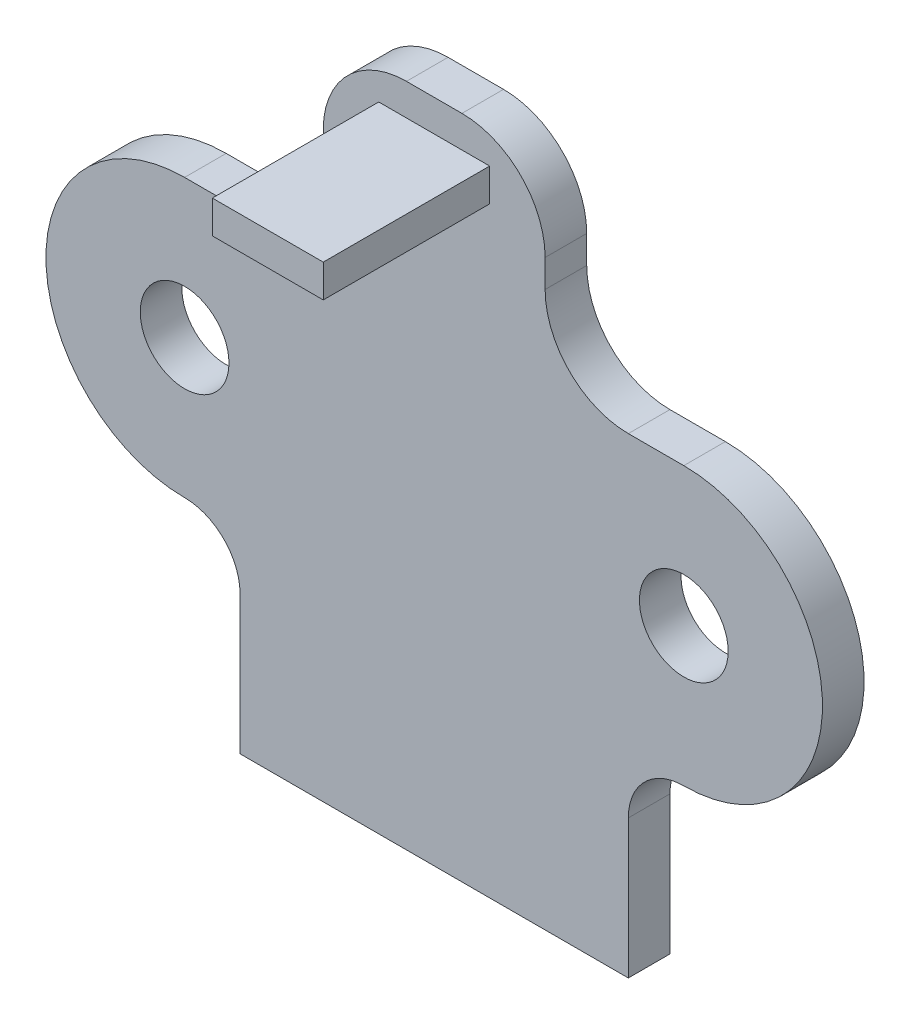
ISO-10303-21;
HEADER;
FILE_DESCRIPTION(('STEP AP214'),'2;1');
FILE_NAME('part.step','',(''),(''),'','','');
FILE_SCHEMA(('AUTOMOTIVE_DESIGN { 1 0 10303 214 1 1 1 1 }'));
ENDSEC;
DATA;
#1=APPLICATION_CONTEXT('core data for automotive mechanical design processes');
#2=APPLICATION_PROTOCOL_DEFINITION('international standard','automotive_design',2000,#1);
#3=PRODUCT_CONTEXT('',#1,'mechanical');
#4=PRODUCT('Part','Part','',(#3));
#5=PRODUCT_RELATED_PRODUCT_CATEGORY('part','',(#4));
#6=PRODUCT_DEFINITION_FORMATION('','',#4);
#7=PRODUCT_DEFINITION_CONTEXT('part definition',#1,'design');
#8=PRODUCT_DEFINITION('design','',#6,#7);
#9=PRODUCT_DEFINITION_SHAPE('','',#8);
#10=(LENGTH_UNIT() NAMED_UNIT(*) SI_UNIT(.MILLI.,.METRE.));
#11=(NAMED_UNIT(*) PLANE_ANGLE_UNIT() SI_UNIT($,.RADIAN.));
#12=(NAMED_UNIT(*) SI_UNIT($,.STERADIAN.) SOLID_ANGLE_UNIT());
#13=UNCERTAINTY_MEASURE_WITH_UNIT(LENGTH_MEASURE(1.E-05),#10,'distance_accuracy_value','');
#14=(GEOMETRIC_REPRESENTATION_CONTEXT(3) GLOBAL_UNCERTAINTY_ASSIGNED_CONTEXT((#13)) GLOBAL_UNIT_ASSIGNED_CONTEXT((#10,
#11,#12)) REPRESENTATION_CONTEXT('',''));
#15=CARTESIAN_POINT('',(0.,0.,0.));
#16=DIRECTION('',(0.,0.,1.));
#17=DIRECTION('',(1.,0.,0.));
#18=AXIS2_PLACEMENT_3D('',#15,#16,#17);
#19=CARTESIAN_POINT('',(-1.,9.,1.5));
#20=DIRECTION('',(0.,0.,1.));
#21=DIRECTION('',(1.,0.,0.));
#22=AXIS2_PLACEMENT_3D('',#19,#20,#21);
#23=PLANE('',#22);
#24=CARTESIAN_POINT('',(-1.,9.,1.5));
#25=DIRECTION('',(0.,0.,1.));
#26=DIRECTION('',(1.,0.,0.));
#27=AXIS2_PLACEMENT_3D('',#24,#25,#26);
#28=CIRCLE('',#27,3.);
#29=CARTESIAN_POINT('',(-1.,12.,1.5));
#30=VERTEX_POINT('',#29);
#31=CARTESIAN_POINT('',(-4.,9.,1.5));
#32=VERTEX_POINT('',#31);
#33=EDGE_CURVE('E191',#30,#32,#28,.T.);
#34=ORIENTED_EDGE('',*,*,#33,.T.);
#35=DIRECTION('',(0.,-1.,0.));
#36=VECTOR('',#35,1.);
#37=CARTESIAN_POINT('',(-4.,9.,1.5));
#38=LINE('',#37,#36);
#39=CARTESIAN_POINT('',(-4.,8.,1.5));
#40=VERTEX_POINT('',#39);
#41=EDGE_CURVE('E194',#32,#40,#38,.T.);
#42=ORIENTED_EDGE('',*,*,#41,.T.);
#43=CARTESIAN_POINT('',(-7.,8.,1.5));
#44=DIRECTION('',(0.,0.,-1.));
#45=DIRECTION('',(-1.,0.,0.));
#46=AXIS2_PLACEMENT_3D('',#43,#44,#45);
#47=CIRCLE('',#46,3.);
#48=CARTESIAN_POINT('',(-7.,5.,1.5));
#49=VERTEX_POINT('',#48);
#50=EDGE_CURVE('E198',#40,#49,#47,.T.);
#51=ORIENTED_EDGE('',*,*,#50,.T.);
#52=DIRECTION('',(-1.,0.,0.));
#53=VECTOR('',#52,1.);
#54=CARTESIAN_POINT('',(-7.,5.,1.5));
#55=LINE('',#54,#53);
#56=CARTESIAN_POINT('',(-9.,5.,1.5));
#57=VERTEX_POINT('',#56);
#58=EDGE_CURVE('E201',#49,#57,#55,.T.);
#59=ORIENTED_EDGE('',*,*,#58,.T.);
#60=CARTESIAN_POINT('',(-9.,0.,1.5));
#61=DIRECTION('',(0.,0.,1.));
#62=DIRECTION('',(1.,0.,0.));
#63=AXIS2_PLACEMENT_3D('',#60,#61,#62);
#64=CIRCLE('',#63,5.);
#65=CARTESIAN_POINT('',(-9.,-5.,1.5));
#66=VERTEX_POINT('',#65);
#67=EDGE_CURVE('E204',#57,#66,#64,.T.);
#68=ORIENTED_EDGE('',*,*,#67,.T.);
#69=CARTESIAN_POINT('',(-9.,-7.,1.5));
#70=DIRECTION('',(0.,0.,-1.));
#71=DIRECTION('',(-1.,0.,0.));
#72=AXIS2_PLACEMENT_3D('',#69,#70,#71);
#73=CIRCLE('',#72,2.);
#74=CARTESIAN_POINT('',(-7.,-7.,1.5));
#75=VERTEX_POINT('',#74);
#76=EDGE_CURVE('E207',#66,#75,#73,.T.);
#77=ORIENTED_EDGE('',*,*,#76,.T.);
#78=DIRECTION('',(0.,-1.,0.));
#79=VECTOR('',#78,1.);
#80=CARTESIAN_POINT('',(-7.,-7.,1.5));
#81=LINE('',#80,#79);
#82=CARTESIAN_POINT('',(-7.,-12.,1.5));
#83=VERTEX_POINT('',#82);
#84=EDGE_CURVE('E210',#75,#83,#81,.T.);
#85=ORIENTED_EDGE('',*,*,#84,.T.);
#86=DIRECTION('',(1.,0.,0.));
#87=VECTOR('',#86,1.);
#88=CARTESIAN_POINT('',(-7.,-12.,1.5));
#89=LINE('',#88,#87);
#90=CARTESIAN_POINT('',(7.,-12.,1.5));
#91=VERTEX_POINT('',#90);
#92=EDGE_CURVE('E213',#83,#91,#89,.T.);
#93=ORIENTED_EDGE('',*,*,#92,.T.);
#94=DIRECTION('',(0.,1.,0.));
#95=VECTOR('',#94,1.);
#96=CARTESIAN_POINT('',(7.,-12.,1.5));
#97=LINE('',#96,#95);
#98=CARTESIAN_POINT('',(7.,-7.,1.5));
#99=VERTEX_POINT('',#98);
#100=EDGE_CURVE('E216',#91,#99,#97,.T.);
#101=ORIENTED_EDGE('',*,*,#100,.T.);
#102=CARTESIAN_POINT('',(9.,-7.,1.5));
#103=DIRECTION('',(0.,0.,-1.));
#104=DIRECTION('',(-1.,0.,0.));
#105=AXIS2_PLACEMENT_3D('',#102,#103,#104);
#106=CIRCLE('',#105,2.);
#107=CARTESIAN_POINT('',(9.,-5.,1.5));
#108=VERTEX_POINT('',#107);
#109=EDGE_CURVE('E219',#99,#108,#106,.T.);
#110=ORIENTED_EDGE('',*,*,#109,.T.);
#111=CARTESIAN_POINT('',(9.,0.,1.5));
#112=DIRECTION('',(0.,0.,1.));
#113=DIRECTION('',(1.,0.,0.));
#114=AXIS2_PLACEMENT_3D('',#111,#112,#113);
#115=CIRCLE('',#114,5.);
#116=CARTESIAN_POINT('',(9.,5.,1.5));
#117=VERTEX_POINT('',#116);
#118=EDGE_CURVE('E222',#108,#117,#115,.T.);
#119=ORIENTED_EDGE('',*,*,#118,.T.);
#120=DIRECTION('',(-1.,0.,0.));
#121=VECTOR('',#120,1.);
#122=CARTESIAN_POINT('',(9.,5.,1.5));
#123=LINE('',#122,#121);
#124=CARTESIAN_POINT('',(7.,5.,1.5));
#125=VERTEX_POINT('',#124);
#126=EDGE_CURVE('E225',#117,#125,#123,.T.);
#127=ORIENTED_EDGE('',*,*,#126,.T.);
#128=CARTESIAN_POINT('',(7.,8.,1.5));
#129=DIRECTION('',(0.,0.,-1.));
#130=DIRECTION('',(-1.,0.,0.));
#131=AXIS2_PLACEMENT_3D('',#128,#129,#130);
#132=CIRCLE('',#131,3.);
#133=CARTESIAN_POINT('',(4.,8.,1.5));
#134=VERTEX_POINT('',#133);
#135=EDGE_CURVE('E228',#125,#134,#132,.T.);
#136=ORIENTED_EDGE('',*,*,#135,.T.);
#137=DIRECTION('',(0.,1.,0.));
#138=VECTOR('',#137,1.);
#139=CARTESIAN_POINT('',(4.,8.,1.5));
#140=LINE('',#139,#138);
#141=CARTESIAN_POINT('',(4.,9.,1.5));
#142=VERTEX_POINT('',#141);
#143=EDGE_CURVE('E231',#134,#142,#140,.T.);
#144=ORIENTED_EDGE('',*,*,#143,.T.);
#145=CARTESIAN_POINT('',(1.,9.,1.5));
#146=DIRECTION('',(0.,0.,1.));
#147=DIRECTION('',(1.,0.,0.));
#148=AXIS2_PLACEMENT_3D('',#145,#146,#147);
#149=CIRCLE('',#148,3.);
#150=CARTESIAN_POINT('',(1.,12.,1.5));
#151=VERTEX_POINT('',#150);
#152=EDGE_CURVE('E168',#142,#151,#149,.T.);
#153=ORIENTED_EDGE('',*,*,#152,.T.);
#154=DIRECTION('',(-1.,0.,0.));
#155=VECTOR('',#154,1.);
#156=CARTESIAN_POINT('',(1.,12.,1.5));
#157=LINE('',#156,#155);
#158=EDGE_CURVE('E234',#151,#30,#157,.T.);
#159=ORIENTED_EDGE('',*,*,#158,.T.);
#160=EDGE_LOOP('',(#34,#42,#51,#59,#68,#77,#85,#93,#101,#110,#119,#127,#136,#144,#153,#159));
#161=FACE_BOUND('',#160,.T.);
#162=CARTESIAN_POINT('',(-9.,0.,1.5));
#163=DIRECTION('',(0.,0.,1.));
#164=DIRECTION('',(1.,0.,0.));
#165=AXIS2_PLACEMENT_3D('',#162,#163,#164);
#166=CIRCLE('',#165,1.59999999999999);
#167=CARTESIAN_POINT('',(-7.40000000000001,0.,1.5));
#168=VERTEX_POINT('',#167);
#169=EDGE_CURVE('E346',#168,#168,#166,.T.);
#170=ORIENTED_EDGE('',*,*,#169,.F.);
#171=EDGE_LOOP('',(#170));
#172=FACE_BOUND('',#171,.T.);
#173=CARTESIAN_POINT('',(9.,0.,1.5));
#174=DIRECTION('',(0.,0.,1.));
#175=DIRECTION('',(1.,0.,0.));
#176=AXIS2_PLACEMENT_3D('',#173,#174,#175);
#177=CIRCLE('',#176,1.59999999999999);
#178=CARTESIAN_POINT('',(10.6,0.,1.5));
#179=VERTEX_POINT('',#178);
#180=EDGE_CURVE('E334',#179,#179,#177,.T.);
#181=ORIENTED_EDGE('',*,*,#180,.F.);
#182=EDGE_LOOP('',(#181));
#183=FACE_BOUND('',#182,.T.);
#184=DIRECTION('',(-1.,0.,0.));
#185=VECTOR('',#184,1.);
#186=CARTESIAN_POINT('',(-2.,10.8553862571716,1.5));
#187=LINE('',#186,#185);
#188=CARTESIAN_POINT('',(2.,10.8553862571716,1.5));
#189=VERTEX_POINT('',#188);
#190=CARTESIAN_POINT('',(-2.,10.8553862571716,1.5));
#191=VERTEX_POINT('',#190);
#192=EDGE_CURVE('E600',#189,#191,#187,.T.);
#193=ORIENTED_EDGE('',*,*,#192,.F.);
#194=DIRECTION('',(0.,1.,0.));
#195=VECTOR('',#194,1.);
#196=CARTESIAN_POINT('',(2.,10.8553862571716,1.5));
#197=LINE('',#196,#195);
#198=CARTESIAN_POINT('',(2.,9.6738475561142,1.5));
#199=VERTEX_POINT('',#198);
#200=EDGE_CURVE('E331',#199,#189,#197,.T.);
#201=ORIENTED_EDGE('',*,*,#200,.F.);
#202=DIRECTION('',(1.,0.,0.));
#203=VECTOR('',#202,1.);
#204=CARTESIAN_POINT('',(2.,9.6738475561142,1.5));
#205=LINE('',#204,#203);
#206=CARTESIAN_POINT('',(-2.,9.6738475561142,1.5));
#207=VERTEX_POINT('',#206);
#208=EDGE_CURVE('E324',#207,#199,#205,.T.);
#209=ORIENTED_EDGE('',*,*,#208,.F.);
#210=DIRECTION('',(0.,-1.,0.));
#211=VECTOR('',#210,1.);
#212=CARTESIAN_POINT('',(-2.,9.6738475561142,1.5));
#213=LINE('',#212,#211);
#214=EDGE_CURVE('E603',#191,#207,#213,.T.);
#215=ORIENTED_EDGE('',*,*,#214,.F.);
#216=EDGE_LOOP('',(#193,#201,#209,#215));
#217=FACE_BOUND('',#216,.T.);
#218=ADVANCED_FACE('F32',(#161,#172,#183,#217),#23,.T.);
#219=CARTESIAN_POINT('',(-1.,9.,0.));
#220=DIRECTION('',(0.,0.,1.));
#221=DIRECTION('',(1.,0.,0.));
#222=AXIS2_PLACEMENT_3D('',#219,#220,#221);
#223=CYLINDRICAL_SURFACE('',#222,3.);
#224=ORIENTED_EDGE('',*,*,#33,.F.);
#225=DIRECTION('',(0.,0.,1.));
#226=VECTOR('',#225,1.);
#227=CARTESIAN_POINT('',(-1.,12.,0.));
#228=LINE('',#227,#226);
#229=CARTESIAN_POINT('',(-1.,12.,0.));
#230=VERTEX_POINT('',#229);
#231=EDGE_CURVE('E11',#230,#30,#228,.T.);
#232=ORIENTED_EDGE('',*,*,#231,.F.);
#233=CARTESIAN_POINT('',(-1.,9.,0.));
#234=DIRECTION('',(0.,0.,1.));
#235=DIRECTION('',(1.,0.,0.));
#236=AXIS2_PLACEMENT_3D('',#233,#234,#235);
#237=CIRCLE('',#236,3.);
#238=CARTESIAN_POINT('',(-4.,9.,0.));
#239=VERTEX_POINT('',#238);
#240=EDGE_CURVE('E236',#230,#239,#237,.T.);
#241=ORIENTED_EDGE('',*,*,#240,.T.);
#242=DIRECTION('',(0.,0.,1.));
#243=VECTOR('',#242,1.);
#244=CARTESIAN_POINT('',(-4.,9.,0.));
#245=LINE('',#244,#243);
#246=EDGE_CURVE('E36',#239,#32,#245,.T.);
#247=ORIENTED_EDGE('',*,*,#246,.T.);
#248=EDGE_LOOP('',(#224,#232,#241,#247));
#249=FACE_BOUND('',#248,.T.);
#250=ADVANCED_FACE('F34',(#249),#223,.T.);
#251=CARTESIAN_POINT('',(1.,12.,0.));
#252=DIRECTION('',(0.,1.,0.));
#253=DIRECTION('',(0.,0.,1.));
#254=AXIS2_PLACEMENT_3D('',#251,#252,#253);
#255=PLANE('',#254);
#256=ORIENTED_EDGE('',*,*,#158,.F.);
#257=DIRECTION('',(0.,0.,1.));
#258=VECTOR('',#257,1.);
#259=CARTESIAN_POINT('',(1.,12.,0.));
#260=LINE('',#259,#258);
#261=CARTESIAN_POINT('',(1.,12.,0.));
#262=VERTEX_POINT('',#261);
#263=EDGE_CURVE('E41',#262,#151,#260,.T.);
#264=ORIENTED_EDGE('',*,*,#263,.F.);
#265=DIRECTION('',(-1.,0.,0.));
#266=VECTOR('',#265,1.);
#267=CARTESIAN_POINT('',(1.,12.,0.));
#268=LINE('',#267,#266);
#269=EDGE_CURVE('E181',#262,#230,#268,.T.);
#270=ORIENTED_EDGE('',*,*,#269,.T.);
#271=ORIENTED_EDGE('',*,*,#231,.T.);
#272=EDGE_LOOP('',(#256,#264,#270,#271));
#273=FACE_BOUND('',#272,.T.);
#274=ADVANCED_FACE('F264',(#273),#255,.T.);
#275=CARTESIAN_POINT('',(1.,9.,0.));
#276=DIRECTION('',(0.,0.,1.));
#277=DIRECTION('',(1.,0.,0.));
#278=AXIS2_PLACEMENT_3D('',#275,#276,#277);
#279=CYLINDRICAL_SURFACE('',#278,3.);
#280=ORIENTED_EDGE('',*,*,#152,.F.);
#281=DIRECTION('',(0.,0.,1.));
#282=VECTOR('',#281,1.);
#283=CARTESIAN_POINT('',(4.,9.,0.));
#284=LINE('',#283,#282);
#285=CARTESIAN_POINT('',(4.,9.,0.));
#286=VERTEX_POINT('',#285);
#287=EDGE_CURVE('E162',#286,#142,#284,.T.);
#288=ORIENTED_EDGE('',*,*,#287,.F.);
#289=CARTESIAN_POINT('',(1.,9.,0.));
#290=DIRECTION('',(0.,0.,1.));
#291=DIRECTION('',(1.,0.,0.));
#292=AXIS2_PLACEMENT_3D('',#289,#290,#291);
#293=CIRCLE('',#292,3.);
#294=EDGE_CURVE('E165',#286,#262,#293,.T.);
#295=ORIENTED_EDGE('',*,*,#294,.T.);
#296=ORIENTED_EDGE('',*,*,#263,.T.);
#297=EDGE_LOOP('',(#280,#288,#295,#296));
#298=FACE_BOUND('',#297,.T.);
#299=ADVANCED_FACE('F164',(#298),#279,.T.);
#300=CARTESIAN_POINT('',(4.,8.,0.));
#301=DIRECTION('',(1.,0.,0.));
#302=DIRECTION('',(0.,0.,-1.));
#303=AXIS2_PLACEMENT_3D('',#300,#301,#302);
#304=PLANE('',#303);
#305=ORIENTED_EDGE('',*,*,#143,.F.);
#306=DIRECTION('',(0.,0.,1.));
#307=VECTOR('',#306,1.);
#308=CARTESIAN_POINT('',(4.,8.,0.));
#309=LINE('',#308,#307);
#310=CARTESIAN_POINT('',(4.,8.,0.));
#311=VERTEX_POINT('',#310);
#312=EDGE_CURVE('E173',#311,#134,#309,.T.);
#313=ORIENTED_EDGE('',*,*,#312,.F.);
#314=DIRECTION('',(0.,1.,0.));
#315=VECTOR('',#314,1.);
#316=CARTESIAN_POINT('',(4.,8.,0.));
#317=LINE('',#316,#315);
#318=EDGE_CURVE('E179',#311,#286,#317,.T.);
#319=ORIENTED_EDGE('',*,*,#318,.T.);
#320=ORIENTED_EDGE('',*,*,#287,.T.);
#321=EDGE_LOOP('',(#305,#313,#319,#320));
#322=FACE_BOUND('',#321,.T.);
#323=ADVANCED_FACE('F183',(#322),#304,.T.);
#324=CARTESIAN_POINT('',(7.,8.,0.));
#325=DIRECTION('',(0.,0.,1.));
#326=DIRECTION('',(1.,0.,0.));
#327=AXIS2_PLACEMENT_3D('',#324,#325,#326);
#328=CYLINDRICAL_SURFACE('',#327,3.);
#329=ORIENTED_EDGE('',*,*,#135,.F.);
#330=DIRECTION('',(0.,0.,1.));
#331=VECTOR('',#330,1.);
#332=CARTESIAN_POINT('',(7.,5.,0.));
#333=LINE('',#332,#331);
#334=CARTESIAN_POINT('',(7.,5.,0.));
#335=VERTEX_POINT('',#334);
#336=EDGE_CURVE('E240',#335,#125,#333,.T.);
#337=ORIENTED_EDGE('',*,*,#336,.F.);
#338=CARTESIAN_POINT('',(7.,8.,0.));
#339=DIRECTION('',(0.,0.,-1.));
#340=DIRECTION('',(-1.,0.,0.));
#341=AXIS2_PLACEMENT_3D('',#338,#339,#340);
#342=CIRCLE('',#341,3.);
#343=EDGE_CURVE('E184',#335,#311,#342,.T.);
#344=ORIENTED_EDGE('',*,*,#343,.T.);
#345=ORIENTED_EDGE('',*,*,#312,.T.);
#346=EDGE_LOOP('',(#329,#337,#344,#345));
#347=FACE_BOUND('',#346,.T.);
#348=ADVANCED_FACE('F422',(#347),#328,.F.);
#349=CARTESIAN_POINT('',(9.,5.,0.));
#350=DIRECTION('',(0.,1.,0.));
#351=DIRECTION('',(0.,0.,1.));
#352=AXIS2_PLACEMENT_3D('',#349,#350,#351);
#353=PLANE('',#352);
#354=ORIENTED_EDGE('',*,*,#126,.F.);
#355=DIRECTION('',(0.,0.,1.));
#356=VECTOR('',#355,1.);
#357=CARTESIAN_POINT('',(9.,5.,0.));
#358=LINE('',#357,#356);
#359=CARTESIAN_POINT('',(9.,5.,0.));
#360=VERTEX_POINT('',#359);
#361=EDGE_CURVE('E242',#360,#117,#358,.T.);
#362=ORIENTED_EDGE('',*,*,#361,.F.);
#363=DIRECTION('',(-1.,0.,0.));
#364=VECTOR('',#363,1.);
#365=CARTESIAN_POINT('',(9.,5.,0.));
#366=LINE('',#365,#364);
#367=EDGE_CURVE('E186',#360,#335,#366,.T.);
#368=ORIENTED_EDGE('',*,*,#367,.T.);
#369=ORIENTED_EDGE('',*,*,#336,.T.);
#370=EDGE_LOOP('',(#354,#362,#368,#369));
#371=FACE_BOUND('',#370,.T.);
#372=ADVANCED_FACE('F384',(#371),#353,.T.);
#373=CARTESIAN_POINT('',(9.,0.,0.));
#374=DIRECTION('',(0.,0.,1.));
#375=DIRECTION('',(1.,0.,0.));
#376=AXIS2_PLACEMENT_3D('',#373,#374,#375);
#377=CYLINDRICAL_SURFACE('',#376,5.);
#378=ORIENTED_EDGE('',*,*,#118,.F.);
#379=DIRECTION('',(0.,0.,1.));
#380=VECTOR('',#379,1.);
#381=CARTESIAN_POINT('',(9.,-5.,0.));
#382=LINE('',#381,#380);
#383=CARTESIAN_POINT('',(9.,-5.,0.));
#384=VERTEX_POINT('',#383);
#385=EDGE_CURVE('E244',#384,#108,#382,.T.);
#386=ORIENTED_EDGE('',*,*,#385,.F.);
#387=CARTESIAN_POINT('',(9.,0.,0.));
#388=DIRECTION('',(0.,0.,1.));
#389=DIRECTION('',(1.,0.,0.));
#390=AXIS2_PLACEMENT_3D('',#387,#388,#389);
#391=CIRCLE('',#390,5.);
#392=EDGE_CURVE('E378',#384,#360,#391,.T.);
#393=ORIENTED_EDGE('',*,*,#392,.T.);
#394=ORIENTED_EDGE('',*,*,#361,.T.);
#395=EDGE_LOOP('',(#378,#386,#393,#394));
#396=FACE_BOUND('',#395,.T.);
#397=ADVANCED_FACE('F390',(#396),#377,.T.);
#398=CARTESIAN_POINT('',(9.,-7.,0.));
#399=DIRECTION('',(0.,0.,1.));
#400=DIRECTION('',(1.,0.,0.));
#401=AXIS2_PLACEMENT_3D('',#398,#399,#400);
#402=CYLINDRICAL_SURFACE('',#401,2.);
#403=ORIENTED_EDGE('',*,*,#109,.F.);
#404=DIRECTION('',(0.,0.,1.));
#405=VECTOR('',#404,1.);
#406=CARTESIAN_POINT('',(7.,-7.,0.));
#407=LINE('',#406,#405);
#408=CARTESIAN_POINT('',(7.,-7.,0.));
#409=VERTEX_POINT('',#408);
#410=EDGE_CURVE('E246',#409,#99,#407,.T.);
#411=ORIENTED_EDGE('',*,*,#410,.F.);
#412=CARTESIAN_POINT('',(9.,-7.,0.));
#413=DIRECTION('',(0.,0.,-1.));
#414=DIRECTION('',(-1.,0.,0.));
#415=AXIS2_PLACEMENT_3D('',#412,#413,#414);
#416=CIRCLE('',#415,2.);
#417=EDGE_CURVE('E375',#409,#384,#416,.T.);
#418=ORIENTED_EDGE('',*,*,#417,.T.);
#419=ORIENTED_EDGE('',*,*,#385,.T.);
#420=EDGE_LOOP('',(#403,#411,#418,#419));
#421=FACE_BOUND('',#420,.T.);
#422=ADVANCED_FACE('F393',(#421),#402,.F.);
#423=CARTESIAN_POINT('',(7.,-12.,0.));
#424=DIRECTION('',(1.,0.,0.));
#425=DIRECTION('',(0.,1.,0.));
#426=AXIS2_PLACEMENT_3D('',#423,#424,#425);
#427=PLANE('',#426);
#428=ORIENTED_EDGE('',*,*,#100,.F.);
#429=DIRECTION('',(0.,0.,1.));
#430=VECTOR('',#429,1.);
#431=CARTESIAN_POINT('',(7.,-12.,0.));
#432=LINE('',#431,#430);
#433=CARTESIAN_POINT('',(7.,-12.,0.));
#434=VERTEX_POINT('',#433);
#435=EDGE_CURVE('E248',#434,#91,#432,.T.);
#436=ORIENTED_EDGE('',*,*,#435,.F.);
#437=DIRECTION('',(0.,1.,0.));
#438=VECTOR('',#437,1.);
#439=CARTESIAN_POINT('',(7.,-12.,0.));
#440=LINE('',#439,#438);
#441=EDGE_CURVE('E372',#434,#409,#440,.T.);
#442=ORIENTED_EDGE('',*,*,#441,.T.);
#443=ORIENTED_EDGE('',*,*,#410,.T.);
#444=EDGE_LOOP('',(#428,#436,#442,#443));
#445=FACE_BOUND('',#444,.T.);
#446=ADVANCED_FACE('F398',(#445),#427,.T.);
#447=CARTESIAN_POINT('',(-7.,-12.,0.));
#448=DIRECTION('',(0.,-1.,0.));
#449=DIRECTION('',(1.,0.,0.));
#450=AXIS2_PLACEMENT_3D('',#447,#448,#449);
#451=PLANE('',#450);
#452=ORIENTED_EDGE('',*,*,#92,.F.);
#453=DIRECTION('',(0.,0.,1.));
#454=VECTOR('',#453,1.);
#455=CARTESIAN_POINT('',(-7.,-12.,0.));
#456=LINE('',#455,#454);
#457=CARTESIAN_POINT('',(-7.,-12.,0.));
#458=VERTEX_POINT('',#457);
#459=EDGE_CURVE('E250',#458,#83,#456,.T.);
#460=ORIENTED_EDGE('',*,*,#459,.F.);
#461=DIRECTION('',(1.,0.,0.));
#462=VECTOR('',#461,1.);
#463=CARTESIAN_POINT('',(-7.,-12.,0.));
#464=LINE('',#463,#462);
#465=EDGE_CURVE('E369',#458,#434,#464,.T.);
#466=ORIENTED_EDGE('',*,*,#465,.T.);
#467=ORIENTED_EDGE('',*,*,#435,.T.);
#468=EDGE_LOOP('',(#452,#460,#466,#467));
#469=FACE_BOUND('',#468,.T.);
#470=ADVANCED_FACE('F401',(#469),#451,.T.);
#471=CARTESIAN_POINT('',(-7.,-7.,0.));
#472=DIRECTION('',(-1.,0.,0.));
#473=DIRECTION('',(0.,-1.,0.));
#474=AXIS2_PLACEMENT_3D('',#471,#472,#473);
#475=PLANE('',#474);
#476=ORIENTED_EDGE('',*,*,#84,.F.);
#477=DIRECTION('',(0.,0.,1.));
#478=VECTOR('',#477,1.);
#479=CARTESIAN_POINT('',(-7.,-7.,0.));
#480=LINE('',#479,#478);
#481=CARTESIAN_POINT('',(-7.,-7.,0.));
#482=VERTEX_POINT('',#481);
#483=EDGE_CURVE('E252',#482,#75,#480,.T.);
#484=ORIENTED_EDGE('',*,*,#483,.F.);
#485=DIRECTION('',(0.,-1.,0.));
#486=VECTOR('',#485,1.);
#487=CARTESIAN_POINT('',(-7.,-7.,0.));
#488=LINE('',#487,#486);
#489=EDGE_CURVE('E366',#482,#458,#488,.T.);
#490=ORIENTED_EDGE('',*,*,#489,.T.);
#491=ORIENTED_EDGE('',*,*,#459,.T.);
#492=EDGE_LOOP('',(#476,#484,#490,#491));
#493=FACE_BOUND('',#492,.T.);
#494=ADVANCED_FACE('F406',(#493),#475,.T.);
#495=CARTESIAN_POINT('',(-9.,-7.,0.));
#496=DIRECTION('',(0.,0.,1.));
#497=DIRECTION('',(1.,0.,0.));
#498=AXIS2_PLACEMENT_3D('',#495,#496,#497);
#499=CYLINDRICAL_SURFACE('',#498,2.);
#500=ORIENTED_EDGE('',*,*,#76,.F.);
#501=DIRECTION('',(0.,0.,1.));
#502=VECTOR('',#501,1.);
#503=CARTESIAN_POINT('',(-9.,-5.,0.));
#504=LINE('',#503,#502);
#505=CARTESIAN_POINT('',(-9.,-5.,0.));
#506=VERTEX_POINT('',#505);
#507=EDGE_CURVE('E254',#506,#66,#504,.T.);
#508=ORIENTED_EDGE('',*,*,#507,.F.);
#509=CARTESIAN_POINT('',(-9.,-7.,0.));
#510=DIRECTION('',(0.,0.,-1.));
#511=DIRECTION('',(-1.,0.,0.));
#512=AXIS2_PLACEMENT_3D('',#509,#510,#511);
#513=CIRCLE('',#512,2.);
#514=EDGE_CURVE('E363',#506,#482,#513,.T.);
#515=ORIENTED_EDGE('',*,*,#514,.T.);
#516=ORIENTED_EDGE('',*,*,#483,.T.);
#517=EDGE_LOOP('',(#500,#508,#515,#516));
#518=FACE_BOUND('',#517,.T.);
#519=ADVANCED_FACE('F409',(#518),#499,.F.);
#520=CARTESIAN_POINT('',(-9.,0.,0.));
#521=DIRECTION('',(0.,0.,1.));
#522=DIRECTION('',(1.,0.,0.));
#523=AXIS2_PLACEMENT_3D('',#520,#521,#522);
#524=CYLINDRICAL_SURFACE('',#523,5.);
#525=ORIENTED_EDGE('',*,*,#67,.F.);
#526=DIRECTION('',(0.,0.,1.));
#527=VECTOR('',#526,1.);
#528=CARTESIAN_POINT('',(-9.,5.,0.));
#529=LINE('',#528,#527);
#530=CARTESIAN_POINT('',(-9.,5.,0.));
#531=VERTEX_POINT('',#530);
#532=EDGE_CURVE('E256',#531,#57,#529,.T.);
#533=ORIENTED_EDGE('',*,*,#532,.F.);
#534=CARTESIAN_POINT('',(-9.,0.,0.));
#535=DIRECTION('',(0.,0.,1.));
#536=DIRECTION('',(1.,0.,0.));
#537=AXIS2_PLACEMENT_3D('',#534,#535,#536);
#538=CIRCLE('',#537,5.);
#539=EDGE_CURVE('E360',#531,#506,#538,.T.);
#540=ORIENTED_EDGE('',*,*,#539,.T.);
#541=ORIENTED_EDGE('',*,*,#507,.T.);
#542=EDGE_LOOP('',(#525,#533,#540,#541));
#543=FACE_BOUND('',#542,.T.);
#544=ADVANCED_FACE('F414',(#543),#524,.T.);
#545=CARTESIAN_POINT('',(-7.,5.,0.));
#546=DIRECTION('',(0.,1.,0.));
#547=DIRECTION('',(-1.,0.,0.));
#548=AXIS2_PLACEMENT_3D('',#545,#546,#547);
#549=PLANE('',#548);
#550=ORIENTED_EDGE('',*,*,#58,.F.);
#551=DIRECTION('',(0.,0.,1.));
#552=VECTOR('',#551,1.);
#553=CARTESIAN_POINT('',(-7.,5.,0.));
#554=LINE('',#553,#552);
#555=CARTESIAN_POINT('',(-7.,5.,0.));
#556=VERTEX_POINT('',#555);
#557=EDGE_CURVE('E258',#556,#49,#554,.T.);
#558=ORIENTED_EDGE('',*,*,#557,.F.);
#559=DIRECTION('',(-1.,0.,0.));
#560=VECTOR('',#559,1.);
#561=CARTESIAN_POINT('',(-7.,5.,0.));
#562=LINE('',#561,#560);
#563=EDGE_CURVE('E357',#556,#531,#562,.T.);
#564=ORIENTED_EDGE('',*,*,#563,.T.);
#565=ORIENTED_EDGE('',*,*,#532,.T.);
#566=EDGE_LOOP('',(#550,#558,#564,#565));
#567=FACE_BOUND('',#566,.T.);
#568=ADVANCED_FACE('F417',(#567),#549,.T.);
#569=CARTESIAN_POINT('',(-7.,8.,0.));
#570=DIRECTION('',(0.,0.,1.));
#571=DIRECTION('',(1.,0.,0.));
#572=AXIS2_PLACEMENT_3D('',#569,#570,#571);
#573=CYLINDRICAL_SURFACE('',#572,3.);
#574=ORIENTED_EDGE('',*,*,#50,.F.);
#575=DIRECTION('',(0.,0.,1.));
#576=VECTOR('',#575,1.);
#577=CARTESIAN_POINT('',(-4.,8.,0.));
#578=LINE('',#577,#576);
#579=CARTESIAN_POINT('',(-4.,8.,0.));
#580=VERTEX_POINT('',#579);
#581=EDGE_CURVE('E259',#580,#40,#578,.T.);
#582=ORIENTED_EDGE('',*,*,#581,.F.);
#583=CARTESIAN_POINT('',(-7.,8.,0.));
#584=DIRECTION('',(0.,0.,-1.));
#585=DIRECTION('',(-1.,0.,0.));
#586=AXIS2_PLACEMENT_3D('',#583,#584,#585);
#587=CIRCLE('',#586,3.);
#588=EDGE_CURVE('E354',#580,#556,#587,.T.);
#589=ORIENTED_EDGE('',*,*,#588,.T.);
#590=ORIENTED_EDGE('',*,*,#557,.T.);
#591=EDGE_LOOP('',(#574,#582,#589,#590));
#592=FACE_BOUND('',#591,.T.);
#593=ADVANCED_FACE('F420',(#592),#573,.F.);
#594=CARTESIAN_POINT('',(-4.,9.,0.));
#595=DIRECTION('',(-1.,0.,0.));
#596=DIRECTION('',(0.,0.,1.));
#597=AXIS2_PLACEMENT_3D('',#594,#595,#596);
#598=PLANE('',#597);
#599=ORIENTED_EDGE('',*,*,#41,.F.);
#600=ORIENTED_EDGE('',*,*,#246,.F.);
#601=DIRECTION('',(0.,-1.,0.));
#602=VECTOR('',#601,1.);
#603=CARTESIAN_POINT('',(-4.,9.,0.));
#604=LINE('',#603,#602);
#605=EDGE_CURVE('E352',#239,#580,#604,.T.);
#606=ORIENTED_EDGE('',*,*,#605,.T.);
#607=ORIENTED_EDGE('',*,*,#581,.T.);
#608=EDGE_LOOP('',(#599,#600,#606,#607));
#609=FACE_BOUND('',#608,.T.);
#610=ADVANCED_FACE('F261',(#609),#598,.T.);
#611=CARTESIAN_POINT('',(-1.,9.,0.));
#612=DIRECTION('',(0.,0.,1.));
#613=DIRECTION('',(1.,0.,0.));
#614=AXIS2_PLACEMENT_3D('',#611,#612,#613);
#615=PLANE('',#614);
#616=CARTESIAN_POINT('',(9.,0.,0.));
#617=DIRECTION('',(0.,0.,1.));
#618=DIRECTION('',(1.,0.,0.));
#619=AXIS2_PLACEMENT_3D('',#616,#617,#618);
#620=CIRCLE('',#619,1.59999999999999);
#621=CARTESIAN_POINT('',(10.6,0.,0.));
#622=VERTEX_POINT('',#621);
#623=EDGE_CURVE('E338',#622,#622,#620,.T.);
#624=ORIENTED_EDGE('',*,*,#623,.T.);
#625=EDGE_LOOP('',(#624));
#626=FACE_BOUND('',#625,.T.);
#627=CARTESIAN_POINT('',(-9.,0.,0.));
#628=DIRECTION('',(0.,0.,1.));
#629=DIRECTION('',(1.,0.,0.));
#630=AXIS2_PLACEMENT_3D('',#627,#628,#629);
#631=CIRCLE('',#630,1.59999999999999);
#632=CARTESIAN_POINT('',(-7.40000000000001,0.,0.));
#633=VERTEX_POINT('',#632);
#634=EDGE_CURVE('E195',#633,#633,#631,.T.);
#635=ORIENTED_EDGE('',*,*,#634,.T.);
#636=EDGE_LOOP('',(#635));
#637=FACE_BOUND('',#636,.T.);
#638=ORIENTED_EDGE('',*,*,#240,.F.);
#639=ORIENTED_EDGE('',*,*,#269,.F.);
#640=ORIENTED_EDGE('',*,*,#294,.F.);
#641=ORIENTED_EDGE('',*,*,#318,.F.);
#642=ORIENTED_EDGE('',*,*,#343,.F.);
#643=ORIENTED_EDGE('',*,*,#367,.F.);
#644=ORIENTED_EDGE('',*,*,#392,.F.);
#645=ORIENTED_EDGE('',*,*,#417,.F.);
#646=ORIENTED_EDGE('',*,*,#441,.F.);
#647=ORIENTED_EDGE('',*,*,#465,.F.);
#648=ORIENTED_EDGE('',*,*,#489,.F.);
#649=ORIENTED_EDGE('',*,*,#514,.F.);
#650=ORIENTED_EDGE('',*,*,#539,.F.);
#651=ORIENTED_EDGE('',*,*,#563,.F.);
#652=ORIENTED_EDGE('',*,*,#588,.F.);
#653=ORIENTED_EDGE('',*,*,#605,.F.);
#654=EDGE_LOOP('',(#638,#639,#640,#641,#642,#643,#644,#645,#646,#647,#648,#649,#650,#651,#652,#653));
#655=FACE_BOUND('',#654,.T.);
#656=ADVANCED_FACE('F177',(#626,#637,#655),#615,.F.);
#657=CARTESIAN_POINT('',(-9.,0.,1.5));
#658=DIRECTION('',(0.,0.,1.));
#659=DIRECTION('',(1.,0.,0.));
#660=AXIS2_PLACEMENT_3D('',#657,#658,#659);
#661=CYLINDRICAL_SURFACE('',#660,1.59999999999999);
#662=ORIENTED_EDGE('',*,*,#634,.F.);
#663=EDGE_LOOP('',(#662));
#664=FACE_BOUND('',#663,.T.);
#665=ORIENTED_EDGE('',*,*,#169,.T.);
#666=EDGE_LOOP('',(#665));
#667=FACE_BOUND('',#666,.T.);
#668=ADVANCED_FACE('F279',(#664,#667),#661,.F.);
#669=CARTESIAN_POINT('',(9.,0.,1.5));
#670=DIRECTION('',(0.,0.,1.));
#671=DIRECTION('',(1.,0.,0.));
#672=AXIS2_PLACEMENT_3D('',#669,#670,#671);
#673=CYLINDRICAL_SURFACE('',#672,1.59999999999999);
#674=ORIENTED_EDGE('',*,*,#623,.F.);
#675=EDGE_LOOP('',(#674));
#676=FACE_BOUND('',#675,.T.);
#677=ORIENTED_EDGE('',*,*,#180,.T.);
#678=EDGE_LOOP('',(#677));
#679=FACE_BOUND('',#678,.T.);
#680=ADVANCED_FACE('F283',(#676,#679),#673,.F.);
#681=CARTESIAN_POINT('',(2.,10.8553862571716,7.5));
#682=DIRECTION('',(-1.,0.,0.));
#683=DIRECTION('',(0.,0.,1.));
#684=AXIS2_PLACEMENT_3D('',#681,#682,#683);
#685=PLANE('',#684);
#686=ORIENTED_EDGE('',*,*,#200,.T.);
#687=DIRECTION('',(0.,0.,-1.));
#688=VECTOR('',#687,1.);
#689=CARTESIAN_POINT('',(2.,10.8553862571716,7.5));
#690=LINE('',#689,#688);
#691=CARTESIAN_POINT('',(2.,10.8553862571716,7.5));
#692=VERTEX_POINT('',#691);
#693=EDGE_CURVE('E328',#692,#189,#690,.T.);
#694=ORIENTED_EDGE('',*,*,#693,.F.);
#695=DIRECTION('',(0.,1.,0.));
#696=VECTOR('',#695,1.);
#697=CARTESIAN_POINT('',(2.,10.8553862571716,7.5));
#698=LINE('',#697,#696);
#699=CARTESIAN_POINT('',(2.,9.6738475561142,7.5));
#700=VERTEX_POINT('',#699);
#701=EDGE_CURVE('E313',#700,#692,#698,.T.);
#702=ORIENTED_EDGE('',*,*,#701,.F.);
#703=DIRECTION('',(0.,0.,-1.));
#704=VECTOR('',#703,1.);
#705=CARTESIAN_POINT('',(2.,9.6738475561142,7.5));
#706=LINE('',#705,#704);
#707=EDGE_CURVE('E611',#700,#199,#706,.T.);
#708=ORIENTED_EDGE('',*,*,#707,.T.);
#709=EDGE_LOOP('',(#686,#694,#702,#708));
#710=FACE_BOUND('',#709,.T.);
#711=ADVANCED_FACE('F287',(#710),#685,.F.);
#712=CARTESIAN_POINT('',(-2.,10.8553862571716,7.5));
#713=DIRECTION('',(0.,-1.,0.));
#714=DIRECTION('',(0.,0.,-1.));
#715=AXIS2_PLACEMENT_3D('',#712,#713,#714);
#716=PLANE('',#715);
#717=ORIENTED_EDGE('',*,*,#192,.T.);
#718=DIRECTION('',(0.,0.,-1.));
#719=VECTOR('',#718,1.);
#720=CARTESIAN_POINT('',(-2.,10.8553862571716,7.5));
#721=LINE('',#720,#719);
#722=CARTESIAN_POINT('',(-2.,10.8553862571716,7.5));
#723=VERTEX_POINT('',#722);
#724=EDGE_CURVE('E335',#723,#191,#721,.T.);
#725=ORIENTED_EDGE('',*,*,#724,.F.);
#726=DIRECTION('',(-1.,0.,0.));
#727=VECTOR('',#726,1.);
#728=CARTESIAN_POINT('',(-2.,10.8553862571716,7.5));
#729=LINE('',#728,#727);
#730=EDGE_CURVE('E318',#692,#723,#729,.T.);
#731=ORIENTED_EDGE('',*,*,#730,.F.);
#732=ORIENTED_EDGE('',*,*,#693,.T.);
#733=EDGE_LOOP('',(#717,#725,#731,#732));
#734=FACE_BOUND('',#733,.T.);
#735=ADVANCED_FACE('F291',(#734),#716,.F.);
#736=CARTESIAN_POINT('',(-2.,9.6738475561142,7.5));
#737=DIRECTION('',(1.,0.,0.));
#738=DIRECTION('',(0.,0.,-1.));
#739=AXIS2_PLACEMENT_3D('',#736,#737,#738);
#740=PLANE('',#739);
#741=ORIENTED_EDGE('',*,*,#214,.T.);
#742=DIRECTION('',(0.,0.,-1.));
#743=VECTOR('',#742,1.);
#744=CARTESIAN_POINT('',(-2.,9.6738475561142,7.5));
#745=LINE('',#744,#743);
#746=CARTESIAN_POINT('',(-2.,9.6738475561142,7.5));
#747=VERTEX_POINT('',#746);
#748=EDGE_CURVE('E49',#747,#207,#745,.T.);
#749=ORIENTED_EDGE('',*,*,#748,.F.);
#750=DIRECTION('',(0.,-1.,0.));
#751=VECTOR('',#750,1.);
#752=CARTESIAN_POINT('',(-2.,9.6738475561142,7.5));
#753=LINE('',#752,#751);
#754=EDGE_CURVE('E612',#723,#747,#753,.T.);
#755=ORIENTED_EDGE('',*,*,#754,.F.);
#756=ORIENTED_EDGE('',*,*,#724,.T.);
#757=EDGE_LOOP('',(#741,#749,#755,#756));
#758=FACE_BOUND('',#757,.T.);
#759=ADVANCED_FACE('F295',(#758),#740,.F.);
#760=CARTESIAN_POINT('',(2.,9.6738475561142,7.5));
#761=DIRECTION('',(0.,1.,0.));
#762=DIRECTION('',(0.,0.,1.));
#763=AXIS2_PLACEMENT_3D('',#760,#761,#762);
#764=PLANE('',#763);
#765=ORIENTED_EDGE('',*,*,#208,.T.);
#766=ORIENTED_EDGE('',*,*,#707,.F.);
#767=DIRECTION('',(1.,0.,0.));
#768=VECTOR('',#767,1.);
#769=CARTESIAN_POINT('',(2.,9.6738475561142,7.5));
#770=LINE('',#769,#768);
#771=EDGE_CURVE('E320',#747,#700,#770,.T.);
#772=ORIENTED_EDGE('',*,*,#771,.F.);
#773=ORIENTED_EDGE('',*,*,#748,.T.);
#774=EDGE_LOOP('',(#765,#766,#772,#773));
#775=FACE_BOUND('',#774,.T.);
#776=ADVANCED_FACE('F299',(#775),#764,.F.);
#777=CARTESIAN_POINT('',(0.,0.,7.5));
#778=DIRECTION('',(0.,0.,-1.));
#779=DIRECTION('',(-1.,0.,0.));
#780=AXIS2_PLACEMENT_3D('',#777,#778,#779);
#781=PLANE('',#780);
#782=ORIENTED_EDGE('',*,*,#701,.T.);
#783=ORIENTED_EDGE('',*,*,#730,.T.);
#784=ORIENTED_EDGE('',*,*,#754,.T.);
#785=ORIENTED_EDGE('',*,*,#771,.T.);
#786=EDGE_LOOP('',(#782,#783,#784,#785));
#787=FACE_BOUND('',#786,.T.);
#788=ADVANCED_FACE('F303',(#787),#781,.F.);
#789=CLOSED_SHELL('',(#218,#250,#274,#299,#323,#348,#372,#397,#422,#446,#470,#494,#519,#544,
#568,#593,#610,#656,#668,#680,#711,#735,#759,#776,#788));
#790=MANIFOLD_SOLID_BREP('B2',#789);
#791=ADVANCED_BREP_SHAPE_REPRESENTATION('',(#18,#790),#14);
#792=SHAPE_DEFINITION_REPRESENTATION(#9,#791);
ENDSEC;
END-ISO-10303-21;
